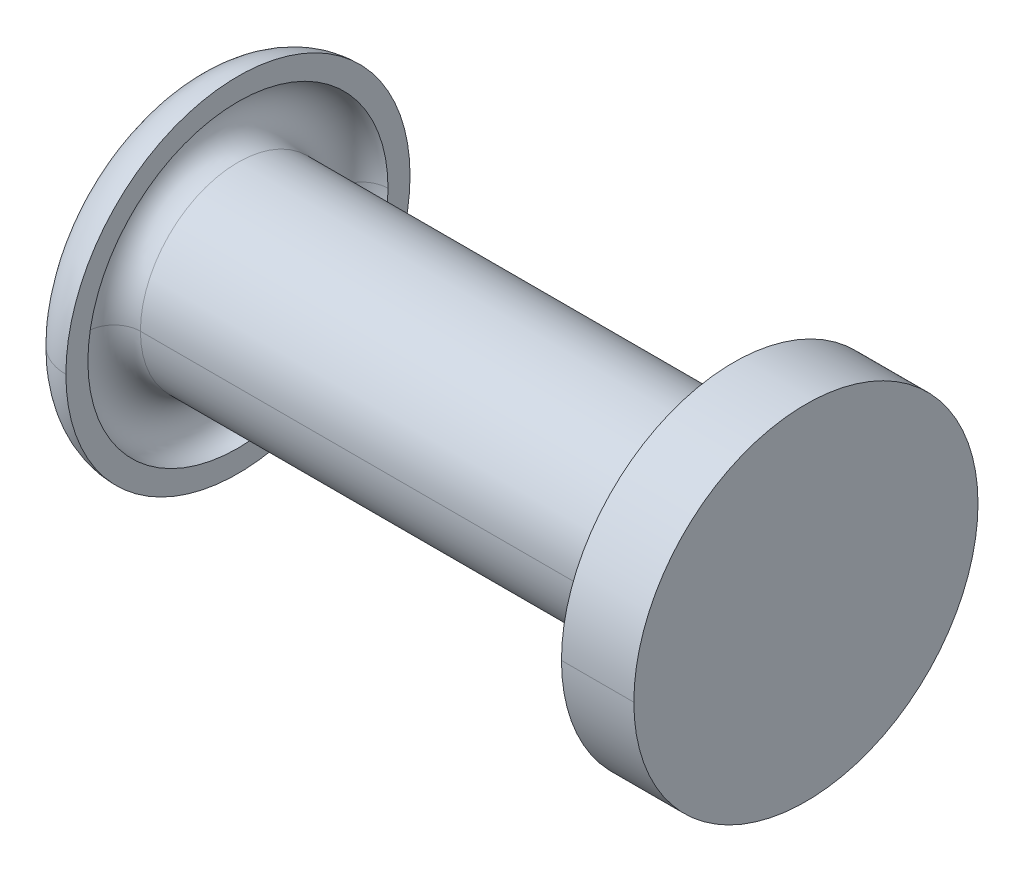
ISO-10303-21;
HEADER;
FILE_DESCRIPTION(('STEP AP214'),'2;1');
FILE_NAME('part.step','',(''),(''),'','','');
FILE_SCHEMA(('AUTOMOTIVE_DESIGN { 1 0 10303 214 1 1 1 1 }'));
ENDSEC;
DATA;
#1=APPLICATION_CONTEXT('core data for automotive mechanical design processes');
#2=APPLICATION_PROTOCOL_DEFINITION('international standard','automotive_design',2000,#1);
#3=PRODUCT_CONTEXT('',#1,'mechanical');
#4=PRODUCT('Part','Part','',(#3));
#5=PRODUCT_RELATED_PRODUCT_CATEGORY('part','',(#4));
#6=PRODUCT_DEFINITION_FORMATION('','',#4);
#7=PRODUCT_DEFINITION_CONTEXT('part definition',#1,'design');
#8=PRODUCT_DEFINITION('design','',#6,#7);
#9=PRODUCT_DEFINITION_SHAPE('','',#8);
#10=(LENGTH_UNIT() NAMED_UNIT(*) SI_UNIT(.MILLI.,.METRE.));
#11=(NAMED_UNIT(*) PLANE_ANGLE_UNIT() SI_UNIT($,.RADIAN.));
#12=(NAMED_UNIT(*) SI_UNIT($,.STERADIAN.) SOLID_ANGLE_UNIT());
#13=UNCERTAINTY_MEASURE_WITH_UNIT(LENGTH_MEASURE(1.E-05),#10,'distance_accuracy_value','');
#14=(GEOMETRIC_REPRESENTATION_CONTEXT(3) GLOBAL_UNCERTAINTY_ASSIGNED_CONTEXT((#13)) GLOBAL_UNIT_ASSIGNED_CONTEXT((#10,
#11,#12)) REPRESENTATION_CONTEXT('',''));
#15=CARTESIAN_POINT('',(0.,0.,0.));
#16=DIRECTION('',(0.,0.,1.));
#17=DIRECTION('',(1.,0.,0.));
#18=AXIS2_PLACEMENT_3D('',#15,#16,#17);
#19=CARTESIAN_POINT('',(5.1689,0.,0.));
#20=DIRECTION('',(-1.,0.,0.));
#21=DIRECTION('',(0.,0.,1.));
#22=AXIS2_PLACEMENT_3D('',#19,#20,#21);
#23=PLANE('',#22);
#24=CARTESIAN_POINT('',(5.16889999999998,0.,0.));
#25=DIRECTION('',(1.,0.,0.));
#26=DIRECTION('',(0.,0.,1.));
#27=AXIS2_PLACEMENT_3D('',#24,#25,#26);
#28=CIRCLE('',#27,2.778125);
#29=CARTESIAN_POINT('',(5.16889999999999,0.,2.778125));
#30=VERTEX_POINT('',#29);
#31=CARTESIAN_POINT('',(5.16889999999999,0.,-2.778125));
#32=VERTEX_POINT('',#31);
#33=EDGE_CURVE('E11',#30,#32,#28,.T.);
#34=ORIENTED_EDGE('',*,*,#33,.T.);
#35=CARTESIAN_POINT('',(5.16889999999998,0.,0.));
#36=DIRECTION('',(1.,0.,0.));
#37=DIRECTION('',(0.,0.,-1.));
#38=AXIS2_PLACEMENT_3D('',#35,#36,#37);
#39=CIRCLE('',#38,2.778125);
#40=EDGE_CURVE('E114',#32,#30,#39,.T.);
#41=ORIENTED_EDGE('',*,*,#40,.T.);
#42=EDGE_LOOP('',(#34,#41));
#43=FACE_BOUND('',#42,.T.);
#44=ADVANCED_FACE('F17',(#43),#23,.F.);
#45=CARTESIAN_POINT('',(33.1437784338811,0.,0.));
#46=DIRECTION('',(1.,0.,0.));
#47=DIRECTION('',(0.,0.,-1.));
#48=AXIS2_PLACEMENT_3D('',#45,#46,#47);
#49=CYLINDRICAL_SURFACE('',#48,2.778125);
#50=CARTESIAN_POINT('',(4.0005,0.,0.));
#51=DIRECTION('',(-1.,0.,0.));
#52=DIRECTION('',(0.,0.,-1.));
#53=AXIS2_PLACEMENT_3D('',#50,#51,#52);
#54=CIRCLE('',#53,2.778125);
#55=CARTESIAN_POINT('',(4.00049999999999,0.,-2.778125));
#56=VERTEX_POINT('',#55);
#57=CARTESIAN_POINT('',(4.00049999999999,0.,2.778125));
#58=VERTEX_POINT('',#57);
#59=EDGE_CURVE('E110',#56,#58,#54,.T.);
#60=ORIENTED_EDGE('',*,*,#59,.F.);
#61=DIRECTION('',(-1.,0.,0.));
#62=VECTOR('',#61,1.);
#63=CARTESIAN_POINT('',(5.16889999999998,0.,-2.778125));
#64=LINE('',#63,#62);
#65=EDGE_CURVE('E108',#32,#56,#64,.T.);
#66=ORIENTED_EDGE('',*,*,#65,.F.);
#67=ORIENTED_EDGE('',*,*,#33,.F.);
#68=DIRECTION('',(-1.,0.,0.));
#69=VECTOR('',#68,1.);
#70=CARTESIAN_POINT('',(5.16889999999998,0.,2.778125));
#71=LINE('',#70,#69);
#72=EDGE_CURVE('E24',#30,#58,#71,.T.);
#73=ORIENTED_EDGE('',*,*,#72,.T.);
#74=EDGE_LOOP('',(#60,#66,#67,#73));
#75=FACE_BOUND('',#74,.T.);
#76=ADVANCED_FACE('F121',(#75),#49,.T.);
#77=CARTESIAN_POINT('',(33.1437784338811,0.,0.));
#78=DIRECTION('',(1.,0.,0.));
#79=DIRECTION('',(0.,0.,-1.));
#80=AXIS2_PLACEMENT_3D('',#77,#78,#79);
#81=CYLINDRICAL_SURFACE('',#80,2.778125);
#82=ORIENTED_EDGE('',*,*,#72,.F.);
#83=ORIENTED_EDGE('',*,*,#40,.F.);
#84=ORIENTED_EDGE('',*,*,#65,.T.);
#85=CARTESIAN_POINT('',(4.0005,0.,0.));
#86=DIRECTION('',(-1.,0.,0.));
#87=DIRECTION('',(0.,0.,1.));
#88=AXIS2_PLACEMENT_3D('',#85,#86,#87);
#89=CIRCLE('',#88,2.778125);
#90=EDGE_CURVE('E92',#58,#56,#89,.T.);
#91=ORIENTED_EDGE('',*,*,#90,.F.);
#92=EDGE_LOOP('',(#82,#83,#84,#91));
#93=FACE_BOUND('',#92,.T.);
#94=ADVANCED_FACE('F123',(#93),#81,.T.);
#95=CARTESIAN_POINT('',(4.0005,-2.778125,0.));
#96=DIRECTION('',(1.,0.,0.));
#97=DIRECTION('',(0.,0.,-1.));
#98=AXIS2_PLACEMENT_3D('',#95,#96,#97);
#99=PLANE('',#98);
#100=CARTESIAN_POINT('',(4.0005,0.,0.));
#101=DIRECTION('',(1.,0.,0.));
#102=DIRECTION('',(0.,0.,1.));
#103=AXIS2_PLACEMENT_3D('',#100,#101,#102);
#104=CIRCLE('',#103,1.5748);
#105=CARTESIAN_POINT('',(4.00049999999999,0.,1.5748));
#106=VERTEX_POINT('',#105);
#107=CARTESIAN_POINT('',(4.00049999999999,0.,-1.5748));
#108=VERTEX_POINT('',#107);
#109=EDGE_CURVE('E84',#106,#108,#104,.T.);
#110=ORIENTED_EDGE('',*,*,#109,.T.);
#111=CARTESIAN_POINT('',(4.0005,0.,0.));
#112=DIRECTION('',(1.,0.,0.));
#113=DIRECTION('',(0.,0.,-1.));
#114=AXIS2_PLACEMENT_3D('',#111,#112,#113);
#115=CIRCLE('',#114,1.5748);
#116=EDGE_CURVE('E87',#108,#106,#115,.T.);
#117=ORIENTED_EDGE('',*,*,#116,.T.);
#118=EDGE_LOOP('',(#110,#117));
#119=FACE_BOUND('',#118,.T.);
#120=ORIENTED_EDGE('',*,*,#59,.T.);
#121=ORIENTED_EDGE('',*,*,#90,.T.);
#122=EDGE_LOOP('',(#120,#121));
#123=FACE_BOUND('',#122,.T.);
#124=ADVANCED_FACE('F83',(#119,#123),#99,.F.);
#125=CARTESIAN_POINT('',(33.1437784338811,0.,0.));
#126=DIRECTION('',(1.,0.,0.));
#127=DIRECTION('',(0.,0.,-1.));
#128=AXIS2_PLACEMENT_3D('',#125,#126,#127);
#129=CYLINDRICAL_SURFACE('',#128,1.5748);
#130=DIRECTION('',(-1.,0.,0.));
#131=VECTOR('',#130,1.);
#132=CARTESIAN_POINT('',(4.00049999999999,0.,1.5748));
#133=LINE('',#132,#131);
#134=CARTESIAN_POINT('',(-4.00049999999999,0.,1.5748));
#135=VERTEX_POINT('',#134);
#136=EDGE_CURVE('E93',#106,#135,#133,.T.);
#137=ORIENTED_EDGE('',*,*,#136,.F.);
#138=ORIENTED_EDGE('',*,*,#116,.F.);
#139=DIRECTION('',(-1.,0.,0.));
#140=VECTOR('',#139,1.);
#141=CARTESIAN_POINT('',(4.00049999999999,0.,-1.5748));
#142=LINE('',#141,#140);
#143=CARTESIAN_POINT('',(-4.00049999999999,0.,-1.5748));
#144=VERTEX_POINT('',#143);
#145=EDGE_CURVE('E89',#108,#144,#142,.T.);
#146=ORIENTED_EDGE('',*,*,#145,.T.);
#147=CARTESIAN_POINT('',(-4.0005,0.,0.));
#148=DIRECTION('',(-1.,0.,0.));
#149=DIRECTION('',(0.,0.,1.));
#150=AXIS2_PLACEMENT_3D('',#147,#148,#149);
#151=CIRCLE('',#150,1.5748);
#152=EDGE_CURVE('E33',#135,#144,#151,.T.);
#153=ORIENTED_EDGE('',*,*,#152,.F.);
#154=EDGE_LOOP('',(#137,#138,#146,#153));
#155=FACE_BOUND('',#154,.T.);
#156=ADVANCED_FACE('F91',(#155),#129,.T.);
#157=CARTESIAN_POINT('',(33.1437784338811,0.,0.));
#158=DIRECTION('',(1.,0.,0.));
#159=DIRECTION('',(0.,0.,-1.));
#160=AXIS2_PLACEMENT_3D('',#157,#158,#159);
#161=CYLINDRICAL_SURFACE('',#160,1.5748);
#162=CARTESIAN_POINT('',(-4.0005,0.,0.));
#163=DIRECTION('',(-1.,0.,0.));
#164=DIRECTION('',(0.,0.,-1.));
#165=AXIS2_PLACEMENT_3D('',#162,#163,#164);
#166=CIRCLE('',#165,1.5748);
#167=EDGE_CURVE('E97',#144,#135,#166,.T.);
#168=ORIENTED_EDGE('',*,*,#167,.F.);
#169=ORIENTED_EDGE('',*,*,#145,.F.);
#170=ORIENTED_EDGE('',*,*,#109,.F.);
#171=ORIENTED_EDGE('',*,*,#136,.T.);
#172=EDGE_LOOP('',(#168,#169,#170,#171));
#173=FACE_BOUND('',#172,.T.);
#174=ADVANCED_FACE('F100',(#173),#161,.T.);
#175=CARTESIAN_POINT('',(-4.0005,0.,0.));
#176=DIRECTION('',(1.,0.,0.));
#177=DIRECTION('',(0.,0.,-1.));
#178=AXIS2_PLACEMENT_3D('',#175,#176,#177);
#179=TOROIDAL_SURFACE('',#178,1.9986625,0.4238625);
#180=CARTESIAN_POINT('',(-4.0005,0.,1.9986625));
#181=DIRECTION('',(0.,-1.,0.));
#182=DIRECTION('',(0.,0.,1.));
#183=AXIS2_PLACEMENT_3D('',#180,#181,#182);
#184=CIRCLE('',#183,0.4238625);
#185=CARTESIAN_POINT('',(-4.0005,0.,2.422525));
#186=VERTEX_POINT('',#185);
#187=EDGE_CURVE('E406',#186,#135,#184,.T.);
#188=ORIENTED_EDGE('',*,*,#187,.F.);
#189=CARTESIAN_POINT('',(-4.0005,0.,0.));
#190=DIRECTION('',(-1.,0.,0.));
#191=DIRECTION('',(0.,0.,-1.));
#192=AXIS2_PLACEMENT_3D('',#189,#190,#191);
#193=CIRCLE('',#192,2.422525);
#194=CARTESIAN_POINT('',(-4.0005,0.,-2.422525));
#195=VERTEX_POINT('',#194);
#196=EDGE_CURVE('E403',#195,#186,#193,.T.);
#197=ORIENTED_EDGE('',*,*,#196,.F.);
#198=CARTESIAN_POINT('',(-4.0005,0.,-1.9986625));
#199=DIRECTION('',(0.,1.,0.));
#200=DIRECTION('',(0.,0.,-1.));
#201=AXIS2_PLACEMENT_3D('',#198,#199,#200);
#202=CIRCLE('',#201,0.4238625);
#203=EDGE_CURVE('E408',#195,#144,#202,.T.);
#204=ORIENTED_EDGE('',*,*,#203,.T.);
#205=ORIENTED_EDGE('',*,*,#167,.T.);
#206=EDGE_LOOP('',(#188,#197,#204,#205));
#207=FACE_BOUND('',#206,.T.);
#208=ADVANCED_FACE('F169',(#207),#179,.F.);
#209=CARTESIAN_POINT('',(-4.0005,0.,0.));
#210=DIRECTION('',(1.,0.,0.));
#211=DIRECTION('',(0.,0.,-1.));
#212=AXIS2_PLACEMENT_3D('',#209,#210,#211);
#213=TOROIDAL_SURFACE('',#212,1.9986625,0.4238625);
#214=ORIENTED_EDGE('',*,*,#152,.T.);
#215=ORIENTED_EDGE('',*,*,#203,.F.);
#216=CARTESIAN_POINT('',(-4.0005,0.,0.));
#217=DIRECTION('',(-1.,0.,0.));
#218=DIRECTION('',(0.,0.,1.));
#219=AXIS2_PLACEMENT_3D('',#216,#217,#218);
#220=CIRCLE('',#219,2.422525);
#221=EDGE_CURVE('E397',#186,#195,#220,.T.);
#222=ORIENTED_EDGE('',*,*,#221,.F.);
#223=ORIENTED_EDGE('',*,*,#187,.T.);
#224=EDGE_LOOP('',(#214,#215,#222,#223));
#225=FACE_BOUND('',#224,.T.);
#226=ADVANCED_FACE('F180',(#225),#213,.F.);
#227=CARTESIAN_POINT('',(-4.0005,-2.422525,0.));
#228=DIRECTION('',(-1.,0.,0.));
#229=DIRECTION('',(0.,0.,1.));
#230=AXIS2_PLACEMENT_3D('',#227,#228,#229);
#231=PLANE('',#230);
#232=ORIENTED_EDGE('',*,*,#196,.T.);
#233=ORIENTED_EDGE('',*,*,#221,.T.);
#234=EDGE_LOOP('',(#232,#233));
#235=FACE_BOUND('',#234,.T.);
#236=CARTESIAN_POINT('',(-4.0005,0.,0.));
#237=DIRECTION('',(1.,0.,0.));
#238=DIRECTION('',(0.,0.,1.));
#239=AXIS2_PLACEMENT_3D('',#236,#237,#238);
#240=CIRCLE('',#239,2.778125);
#241=CARTESIAN_POINT('',(-4.0005,0.,2.778125));
#242=VERTEX_POINT('',#241);
#243=CARTESIAN_POINT('',(-4.0005,0.,-2.778125));
#244=VERTEX_POINT('',#243);
#245=EDGE_CURVE('E36',#242,#244,#240,.T.);
#246=ORIENTED_EDGE('',*,*,#245,.T.);
#247=CARTESIAN_POINT('',(-4.0005,0.,0.));
#248=DIRECTION('',(1.,0.,0.));
#249=DIRECTION('',(0.,0.,-1.));
#250=AXIS2_PLACEMENT_3D('',#247,#248,#249);
#251=CIRCLE('',#250,2.778125);
#252=EDGE_CURVE('E400',#244,#242,#251,.T.);
#253=ORIENTED_EDGE('',*,*,#252,.T.);
#254=EDGE_LOOP('',(#246,#253));
#255=FACE_BOUND('',#254,.T.);
#256=ADVANCED_FACE('F190',(#235,#255),#231,.F.);
#257=CARTESIAN_POINT('',(-4.0005,0.,0.));
#258=DIRECTION('',(1.,0.,0.));
#259=DIRECTION('',(0.,0.,-1.));
#260=AXIS2_PLACEMENT_3D('',#257,#258,#259);
#261=TOROIDAL_SURFACE('',#260,1.9986625,0.7794625);
#262=CARTESIAN_POINT('',(-4.0005,0.,1.9986625));
#263=DIRECTION('',(0.,-1.,0.));
#264=DIRECTION('',(0.,0.,1.));
#265=AXIS2_PLACEMENT_3D('',#262,#263,#264);
#266=CIRCLE('',#265,0.7794625);
#267=CARTESIAN_POINT('',(-4.00049999999999,0.,1.2192));
#268=VERTEX_POINT('',#267);
#269=EDGE_CURVE('E389',#242,#268,#266,.T.);
#270=ORIENTED_EDGE('',*,*,#269,.F.);
#271=ORIENTED_EDGE('',*,*,#252,.F.);
#272=CARTESIAN_POINT('',(-4.0005,0.,-1.9986625));
#273=DIRECTION('',(0.,1.,0.));
#274=DIRECTION('',(0.,0.,-1.));
#275=AXIS2_PLACEMENT_3D('',#272,#273,#274);
#276=CIRCLE('',#275,0.7794625);
#277=CARTESIAN_POINT('',(-4.00049999999999,0.,-1.2192));
#278=VERTEX_POINT('',#277);
#279=EDGE_CURVE('E395',#244,#278,#276,.T.);
#280=ORIENTED_EDGE('',*,*,#279,.T.);
#281=CARTESIAN_POINT('',(-4.0005,0.,0.));
#282=DIRECTION('',(1.,0.,0.));
#283=DIRECTION('',(0.,0.,-1.));
#284=AXIS2_PLACEMENT_3D('',#281,#282,#283);
#285=CIRCLE('',#284,1.2192);
#286=EDGE_CURVE('E390',#278,#268,#285,.T.);
#287=ORIENTED_EDGE('',*,*,#286,.T.);
#288=EDGE_LOOP('',(#270,#271,#280,#287));
#289=FACE_BOUND('',#288,.T.);
#290=ADVANCED_FACE('F197',(#289),#261,.T.);
#291=CARTESIAN_POINT('',(-4.0005,0.,0.));
#292=DIRECTION('',(1.,0.,0.));
#293=DIRECTION('',(0.,0.,-1.));
#294=AXIS2_PLACEMENT_3D('',#291,#292,#293);
#295=TOROIDAL_SURFACE('',#294,1.9986625,0.7794625);
#296=CARTESIAN_POINT('',(-4.0005,0.,0.));
#297=DIRECTION('',(1.,0.,0.));
#298=DIRECTION('',(0.,0.,1.));
#299=AXIS2_PLACEMENT_3D('',#296,#297,#298);
#300=CIRCLE('',#299,1.2192);
#301=EDGE_CURVE('E391',#268,#278,#300,.T.);
#302=ORIENTED_EDGE('',*,*,#301,.T.);
#303=ORIENTED_EDGE('',*,*,#279,.F.);
#304=ORIENTED_EDGE('',*,*,#245,.F.);
#305=ORIENTED_EDGE('',*,*,#269,.T.);
#306=EDGE_LOOP('',(#302,#303,#304,#305));
#307=FACE_BOUND('',#306,.T.);
#308=ADVANCED_FACE('F210',(#307),#295,.T.);
#309=CARTESIAN_POINT('',(33.1437784338811,0.,0.));
#310=DIRECTION('',(1.,0.,0.));
#311=DIRECTION('',(0.,0.,-1.));
#312=AXIS2_PLACEMENT_3D('',#309,#310,#311);
#313=CYLINDRICAL_SURFACE('',#312,1.2192);
#314=DIRECTION('',(-1.,0.,0.));
#315=VECTOR('',#314,1.);
#316=CARTESIAN_POINT('',(-3.11150000000003,0.,1.2192));
#317=LINE('',#316,#315);
#318=CARTESIAN_POINT('',(-3.11149999999998,0.,1.21920000000002));
#319=VERTEX_POINT('',#318);
#320=EDGE_CURVE('E380',#319,#268,#317,.T.);
#321=ORIENTED_EDGE('',*,*,#320,.F.);
#322=CARTESIAN_POINT('',(-3.11149999999993,0.,0.));
#323=DIRECTION('',(-1.,0.,0.));
#324=DIRECTION('',(0.,0.,-1.));
#325=AXIS2_PLACEMENT_3D('',#322,#323,#324);
#326=CIRCLE('',#325,1.21920000000004);
#327=CARTESIAN_POINT('',(-3.11149999999998,0.,-1.21920000000002));
#328=VERTEX_POINT('',#327);
#329=EDGE_CURVE('E371',#328,#319,#326,.T.);
#330=ORIENTED_EDGE('',*,*,#329,.F.);
#331=DIRECTION('',(-1.,0.,0.));
#332=VECTOR('',#331,1.);
#333=CARTESIAN_POINT('',(-3.11150000000003,0.,-1.2192));
#334=LINE('',#333,#332);
#335=EDGE_CURVE('E383',#328,#278,#334,.T.);
#336=ORIENTED_EDGE('',*,*,#335,.T.);
#337=ORIENTED_EDGE('',*,*,#301,.F.);
#338=EDGE_LOOP('',(#321,#330,#336,#337));
#339=FACE_BOUND('',#338,.T.);
#340=ADVANCED_FACE('F220',(#339),#313,.F.);
#341=CARTESIAN_POINT('',(33.1437784338811,0.,0.));
#342=DIRECTION('',(1.,0.,0.));
#343=DIRECTION('',(0.,0.,-1.));
#344=AXIS2_PLACEMENT_3D('',#341,#342,#343);
#345=CYLINDRICAL_SURFACE('',#344,1.2192);
#346=ORIENTED_EDGE('',*,*,#286,.F.);
#347=ORIENTED_EDGE('',*,*,#335,.F.);
#348=CARTESIAN_POINT('',(-3.11149999999993,0.,0.));
#349=DIRECTION('',(-1.,0.,0.));
#350=DIRECTION('',(0.,0.,1.));
#351=AXIS2_PLACEMENT_3D('',#348,#349,#350);
#352=CIRCLE('',#351,1.21920000000004);
#353=EDGE_CURVE('E374',#319,#328,#352,.T.);
#354=ORIENTED_EDGE('',*,*,#353,.F.);
#355=ORIENTED_EDGE('',*,*,#320,.T.);
#356=EDGE_LOOP('',(#346,#347,#354,#355));
#357=FACE_BOUND('',#356,.T.);
#358=ADVANCED_FACE('F227',(#357),#345,.F.);
#359=CARTESIAN_POINT('',(-2.37893073328151,0.,0.));
#360=DIRECTION('',(-1.,0.,0.));
#361=DIRECTION('',(0.,0.,1.));
#362=AXIS2_PLACEMENT_3D('',#359,#360,#361);
#363=CONICAL_SURFACE('',#362,0.,1.02974425867666);
#364=DIRECTION('',(0.515038074910053,0.,-0.857167300702113));
#365=VECTOR('',#364,1.);
#366=CARTESIAN_POINT('',(-3.11149999999993,0.,1.21920000000004));
#367=LINE('',#366,#365);
#368=CARTESIAN_POINT('',(-2.37893073328151,0.,0.));
#369=VERTEX_POINT('',#368);
#370=EDGE_CURVE('E373',#319,#369,#367,.T.);
#371=ORIENTED_EDGE('',*,*,#370,.F.);
#372=ORIENTED_EDGE('',*,*,#353,.T.);
#373=DIRECTION('',(0.515038074910053,0.,0.857167300702113));
#374=VECTOR('',#373,1.);
#375=CARTESIAN_POINT('',(-3.11149999999993,0.,-1.21920000000004));
#376=LINE('',#375,#374);
#377=EDGE_CURVE('E367',#328,#369,#376,.T.);
#378=ORIENTED_EDGE('',*,*,#377,.T.);
#379=EDGE_LOOP('',(#371,#372,#378));
#380=FACE_BOUND('',#379,.T.);
#381=ADVANCED_FACE('F236',(#380),#363,.F.);
#382=CARTESIAN_POINT('',(-2.37893073328151,0.,0.));
#383=DIRECTION('',(-1.,0.,0.));
#384=DIRECTION('',(0.,0.,1.));
#385=AXIS2_PLACEMENT_3D('',#382,#383,#384);
#386=CONICAL_SURFACE('',#385,0.,1.02974425867666);
#387=ORIENTED_EDGE('',*,*,#377,.F.);
#388=ORIENTED_EDGE('',*,*,#329,.T.);
#389=ORIENTED_EDGE('',*,*,#370,.T.);
#390=EDGE_LOOP('',(#387,#388,#389));
#391=FACE_BOUND('',#390,.T.);
#392=ADVANCED_FACE('F250',(#391),#386,.F.);
#393=CLOSED_SHELL('',(#44,#76,#94,#124,#156,#174,#208,#226,#256,#290,#308,#340,#358,#381,#392));
#394=MANIFOLD_SOLID_BREP('B1',#393);
#395=ADVANCED_BREP_SHAPE_REPRESENTATION('',(#18,#394),#14);
#396=SHAPE_DEFINITION_REPRESENTATION(#9,#395);
ENDSEC;
END-ISO-10303-21;
